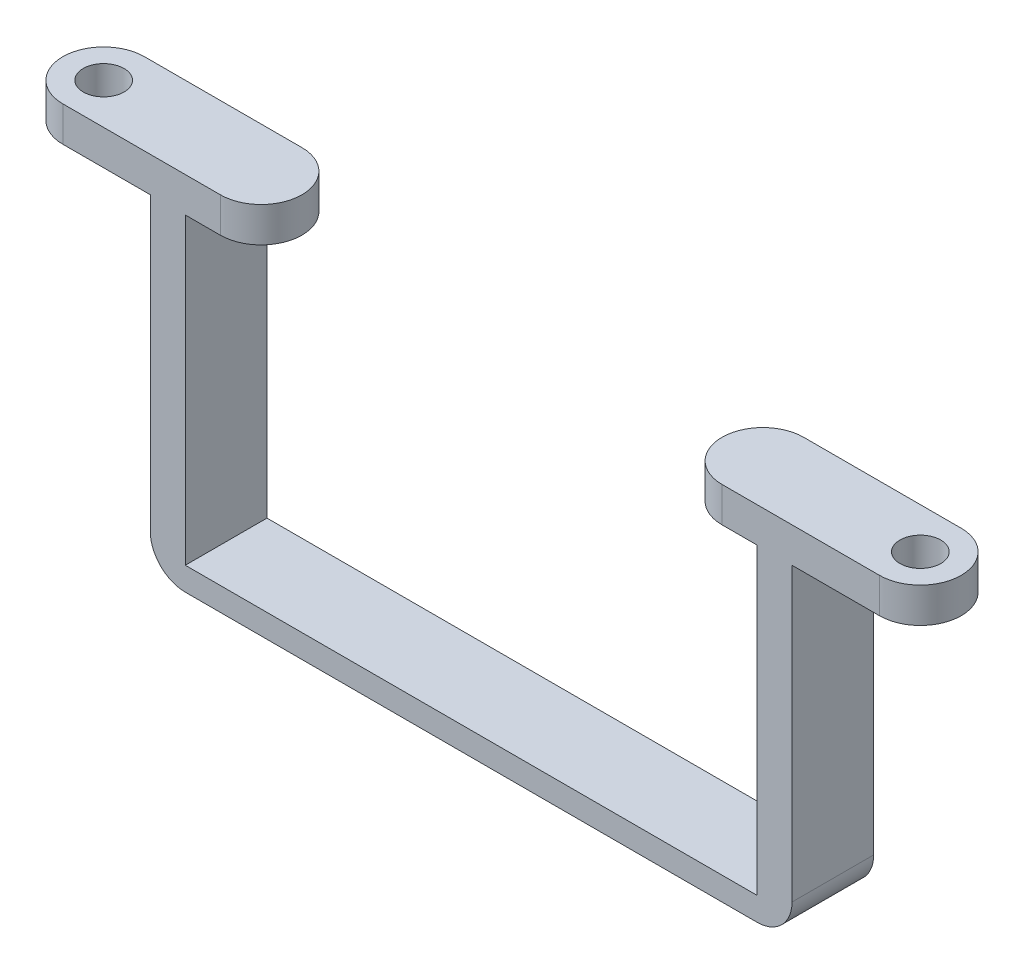
ISO-10303-21;
HEADER;
FILE_DESCRIPTION(('STEP AP214'),'2;1');
FILE_NAME('part.step','',(''),(''),'','','');
FILE_SCHEMA(('AUTOMOTIVE_DESIGN { 1 0 10303 214 1 1 1 1 }'));
ENDSEC;
DATA;
#1=APPLICATION_CONTEXT('core data for automotive mechanical design processes');
#2=APPLICATION_PROTOCOL_DEFINITION('international standard','automotive_design',2000,#1);
#3=PRODUCT_CONTEXT('',#1,'mechanical');
#4=PRODUCT('Part','Part','',(#3));
#5=PRODUCT_RELATED_PRODUCT_CATEGORY('part','',(#4));
#6=PRODUCT_DEFINITION_FORMATION('','',#4);
#7=PRODUCT_DEFINITION_CONTEXT('part definition',#1,'design');
#8=PRODUCT_DEFINITION('design','',#6,#7);
#9=PRODUCT_DEFINITION_SHAPE('','',#8);
#10=(LENGTH_UNIT() NAMED_UNIT(*) SI_UNIT(.MILLI.,.METRE.));
#11=(NAMED_UNIT(*) PLANE_ANGLE_UNIT() SI_UNIT($,.RADIAN.));
#12=(NAMED_UNIT(*) SI_UNIT($,.STERADIAN.) SOLID_ANGLE_UNIT());
#13=UNCERTAINTY_MEASURE_WITH_UNIT(LENGTH_MEASURE(1.E-05),#10,'distance_accuracy_value','');
#14=(GEOMETRIC_REPRESENTATION_CONTEXT(3) GLOBAL_UNCERTAINTY_ASSIGNED_CONTEXT((#13)) GLOBAL_UNIT_ASSIGNED_CONTEXT((#10,
#11,#12)) REPRESENTATION_CONTEXT('',''));
#15=CARTESIAN_POINT('',(0.,0.,0.));
#16=DIRECTION('',(0.,0.,1.));
#17=DIRECTION('',(1.,0.,0.));
#18=AXIS2_PLACEMENT_3D('',#15,#16,#17);
#19=CARTESIAN_POINT('',(0.,0.,0.));
#20=DIRECTION('',(0.,1.,0.));
#21=DIRECTION('',(0.,0.,1.));
#22=AXIS2_PLACEMENT_3D('',#19,#20,#21);
#23=PLANE('',#22);
#24=DIRECTION('',(1.,0.,0.));
#25=VECTOR('',#24,1.);
#26=CARTESIAN_POINT('',(10.5,0.,3.49999999999996));
#27=LINE('',#26,#25);
#28=CARTESIAN_POINT('',(10.5,0.,3.49999999999996));
#29=VERTEX_POINT('',#28);
#30=CARTESIAN_POINT('',(13.5,0.,3.49999999999996));
#31=VERTEX_POINT('',#30);
#32=EDGE_CURVE('E285',#29,#31,#27,.T.);
#33=ORIENTED_EDGE('',*,*,#32,.F.);
#34=DIRECTION('',(0.,0.,-1.));
#35=VECTOR('',#34,1.);
#36=CARTESIAN_POINT('',(10.5,0.,3.49999999999996));
#37=LINE('',#36,#35);
#38=CARTESIAN_POINT('',(10.5,0.,-3.49999999999996));
#39=VERTEX_POINT('',#38);
#40=EDGE_CURVE('E248',#29,#39,#37,.T.);
#41=ORIENTED_EDGE('',*,*,#40,.T.);
#42=DIRECTION('',(-1.,0.,0.));
#43=VECTOR('',#42,1.);
#44=CARTESIAN_POINT('',(0.,0.,-3.49999999999996));
#45=LINE('',#44,#43);
#46=CARTESIAN_POINT('',(13.5,0.,-3.49999999999996));
#47=VERTEX_POINT('',#46);
#48=EDGE_CURVE('E276',#47,#39,#45,.T.);
#49=ORIENTED_EDGE('',*,*,#48,.F.);
#50=CARTESIAN_POINT('',(13.5,0.,0.));
#51=DIRECTION('',(0.,1.,0.));
#52=DIRECTION('',(0.,0.,1.));
#53=AXIS2_PLACEMENT_3D('',#50,#51,#52);
#54=CIRCLE('',#53,3.49999999999996);
#55=EDGE_CURVE('E289',#31,#47,#54,.T.);
#56=ORIENTED_EDGE('',*,*,#55,.F.);
#57=EDGE_LOOP('',(#33,#41,#49,#56));
#58=FACE_BOUND('',#57,.T.);
#59=ADVANCED_FACE('F39',(#58),#23,.F.);
#60=CARTESIAN_POINT('',(0.,3.,0.));
#61=DIRECTION('',(0.,1.,0.));
#62=DIRECTION('',(0.,0.,1.));
#63=AXIS2_PLACEMENT_3D('',#60,#61,#62);
#64=PLANE('',#63);
#65=CARTESIAN_POINT('',(0.,3.,0.));
#66=DIRECTION('',(0.,1.,0.));
#67=DIRECTION('',(0.,0.,1.));
#68=AXIS2_PLACEMENT_3D('',#65,#66,#67);
#69=CIRCLE('',#68,3.49999999999996);
#70=CARTESIAN_POINT('',(0.,3.,-3.49999999999996));
#71=VERTEX_POINT('',#70);
#72=CARTESIAN_POINT('',(0.,3.,3.49999999999996));
#73=VERTEX_POINT('',#72);
#74=EDGE_CURVE('E272',#71,#73,#69,.T.);
#75=ORIENTED_EDGE('',*,*,#74,.T.);
#76=DIRECTION('',(1.,0.,0.));
#77=VECTOR('',#76,1.);
#78=CARTESIAN_POINT('',(10.5,3.,3.49999999999996));
#79=LINE('',#78,#77);
#80=CARTESIAN_POINT('',(13.5,3.,3.49999999999996));
#81=VERTEX_POINT('',#80);
#82=EDGE_CURVE('E275',#73,#81,#79,.T.);
#83=ORIENTED_EDGE('',*,*,#82,.T.);
#84=CARTESIAN_POINT('',(13.5,3.,0.));
#85=DIRECTION('',(0.,1.,0.));
#86=DIRECTION('',(0.,0.,1.));
#87=AXIS2_PLACEMENT_3D('',#84,#85,#86);
#88=CIRCLE('',#87,3.49999999999996);
#89=CARTESIAN_POINT('',(13.5,3.,-3.49999999999996));
#90=VERTEX_POINT('',#89);
#91=EDGE_CURVE('E278',#81,#90,#88,.T.);
#92=ORIENTED_EDGE('',*,*,#91,.T.);
#93=DIRECTION('',(-1.,0.,0.));
#94=VECTOR('',#93,1.);
#95=CARTESIAN_POINT('',(10.5,3.,-3.49999999999996));
#96=LINE('',#95,#94);
#97=EDGE_CURVE('E280',#90,#71,#96,.T.);
#98=ORIENTED_EDGE('',*,*,#97,.T.);
#99=EDGE_LOOP('',(#75,#83,#92,#98));
#100=FACE_BOUND('',#99,.T.);
#101=CARTESIAN_POINT('',(0.,3.,0.));
#102=DIRECTION('',(0.,1.,0.));
#103=DIRECTION('',(0.,0.,1.));
#104=AXIS2_PLACEMENT_3D('',#101,#102,#103);
#105=CIRCLE('',#104,1.75);
#106=CARTESIAN_POINT('',(0.,3.,1.75));
#107=VERTEX_POINT('',#106);
#108=EDGE_CURVE('E266',#107,#107,#105,.T.);
#109=ORIENTED_EDGE('',*,*,#108,.F.);
#110=EDGE_LOOP('',(#109));
#111=FACE_BOUND('',#110,.T.);
#112=ADVANCED_FACE('F361',(#100,#111),#64,.T.);
#113=CARTESIAN_POINT('',(7.5,0.,-3.49999999999996));
#114=VERTEX_POINT('',#113);
#115=CARTESIAN_POINT('',(0.,0.,-3.49999999999996));
#116=VERTEX_POINT('',#115);
#117=EDGE_CURVE('E292',#114,#116,#45,.T.);
#118=ORIENTED_EDGE('',*,*,#117,.F.);
#119=DIRECTION('',(0.,0.,1.));
#120=VECTOR('',#119,1.);
#121=CARTESIAN_POINT('',(7.5,0.,-3.49999999999996));
#122=LINE('',#121,#120);
#123=CARTESIAN_POINT('',(7.5,0.,3.49999999999996));
#124=VERTEX_POINT('',#123);
#125=EDGE_CURVE('E251',#114,#124,#122,.T.);
#126=ORIENTED_EDGE('',*,*,#125,.T.);
#127=CARTESIAN_POINT('',(0.,0.,3.49999999999996));
#128=VERTEX_POINT('',#127);
#129=EDGE_CURVE('E286',#128,#124,#27,.T.);
#130=ORIENTED_EDGE('',*,*,#129,.F.);
#131=CARTESIAN_POINT('',(0.,0.,0.));
#132=DIRECTION('',(0.,1.,0.));
#133=DIRECTION('',(0.,0.,1.));
#134=AXIS2_PLACEMENT_3D('',#131,#132,#133);
#135=CIRCLE('',#134,3.49999999999996);
#136=EDGE_CURVE('E269',#116,#128,#135,.T.);
#137=ORIENTED_EDGE('',*,*,#136,.F.);
#138=EDGE_LOOP('',(#118,#126,#130,#137));
#139=FACE_BOUND('',#138,.T.);
#140=CARTESIAN_POINT('',(0.,0.,0.));
#141=DIRECTION('',(0.,1.,0.));
#142=DIRECTION('',(0.,0.,1.));
#143=AXIS2_PLACEMENT_3D('',#140,#141,#142);
#144=CIRCLE('',#143,1.75);
#145=CARTESIAN_POINT('',(0.,0.,1.75));
#146=VERTEX_POINT('',#145);
#147=EDGE_CURVE('E265',#146,#146,#144,.T.);
#148=ORIENTED_EDGE('',*,*,#147,.T.);
#149=EDGE_LOOP('',(#148));
#150=FACE_BOUND('',#149,.T.);
#151=ADVANCED_FACE('F364',(#139,#150),#23,.F.);
#152=CARTESIAN_POINT('',(0.,3.,0.));
#153=DIRECTION('',(0.,-1.,0.));
#154=DIRECTION('',(0.,0.,-1.));
#155=AXIS2_PLACEMENT_3D('',#152,#153,#154);
#156=CYLINDRICAL_SURFACE('',#155,3.49999999999996);
#157=ORIENTED_EDGE('',*,*,#136,.T.);
#158=DIRECTION('',(0.,-1.,0.));
#159=VECTOR('',#158,1.);
#160=CARTESIAN_POINT('',(0.,3.,3.49999999999996));
#161=LINE('',#160,#159);
#162=EDGE_CURVE('E303',#73,#128,#161,.T.);
#163=ORIENTED_EDGE('',*,*,#162,.F.);
#164=ORIENTED_EDGE('',*,*,#74,.F.);
#165=DIRECTION('',(0.,-1.,0.));
#166=VECTOR('',#165,1.);
#167=CARTESIAN_POINT('',(0.,3.,-3.49999999999996));
#168=LINE('',#167,#166);
#169=EDGE_CURVE('E282',#71,#116,#168,.T.);
#170=ORIENTED_EDGE('',*,*,#169,.T.);
#171=EDGE_LOOP('',(#157,#163,#164,#170));
#172=FACE_BOUND('',#171,.T.);
#173=ADVANCED_FACE('F376',(#172),#156,.T.);
#174=CARTESIAN_POINT('',(10.5,3.,3.49999999999996));
#175=DIRECTION('',(0.,0.,-1.));
#176=DIRECTION('',(-1.,0.,0.));
#177=AXIS2_PLACEMENT_3D('',#174,#175,#176);
#178=PLANE('',#177);
#179=DIRECTION('',(0.,1.,0.));
#180=VECTOR('',#179,1.);
#181=CARTESIAN_POINT('',(7.5,-34.6157731058638,3.49999999999996));
#182=LINE('',#181,#180);
#183=CARTESIAN_POINT('',(7.5,-25.,3.49999999999996));
#184=VERTEX_POINT('',#183);
#185=EDGE_CURVE('E261',#184,#124,#182,.T.);
#186=ORIENTED_EDGE('',*,*,#185,.F.);
#187=CARTESIAN_POINT('',(10.5,-25.,3.49999999999996));
#188=DIRECTION('',(0.,0.,-1.));
#189=DIRECTION('',(-1.,0.,0.));
#190=AXIS2_PLACEMENT_3D('',#187,#188,#189);
#191=CIRCLE('',#190,3.);
#192=CARTESIAN_POINT('',(10.5,-28.,3.49999999999996));
#193=VERTEX_POINT('',#192);
#194=EDGE_CURVE('E11',#184,#193,#191,.F.);
#195=ORIENTED_EDGE('',*,*,#194,.T.);
#196=DIRECTION('',(-1.,0.,0.));
#197=VECTOR('',#196,1.);
#198=CARTESIAN_POINT('',(34.9999996403708,-28.,3.49999999999997));
#199=LINE('',#198,#197);
#200=CARTESIAN_POINT('',(59.4999992807416,-28.,3.49999999999996));
#201=VERTEX_POINT('',#200);
#202=EDGE_CURVE('E244',#201,#193,#199,.T.);
#203=ORIENTED_EDGE('',*,*,#202,.F.);
#204=CARTESIAN_POINT('',(59.4999992807416,-25.,3.49999999999996));
#205=DIRECTION('',(0.,0.,1.));
#206=DIRECTION('',(1.,0.,0.));
#207=AXIS2_PLACEMENT_3D('',#204,#205,#206);
#208=CIRCLE('',#207,3.);
#209=CARTESIAN_POINT('',(62.4999992807416,-25.,3.49999999999996));
#210=VERTEX_POINT('',#209);
#211=EDGE_CURVE('E173',#210,#201,#208,.F.);
#212=ORIENTED_EDGE('',*,*,#211,.F.);
#213=DIRECTION('',(0.,1.,0.));
#214=VECTOR('',#213,1.);
#215=CARTESIAN_POINT('',(62.4999992807416,-34.6157731058638,3.49999999999996));
#216=LINE('',#215,#214);
#217=CARTESIAN_POINT('',(62.4999992807416,0.,3.49999999999996));
#218=VERTEX_POINT('',#217);
#219=EDGE_CURVE('E186',#210,#218,#216,.T.);
#220=ORIENTED_EDGE('',*,*,#219,.T.);
#221=DIRECTION('',(-1.,0.,0.));
#222=VECTOR('',#221,1.);
#223=CARTESIAN_POINT('',(59.4999992807416,0.,3.49999999999996));
#224=LINE('',#223,#222);
#225=CARTESIAN_POINT('',(69.9999992807416,0.,3.49999999999996));
#226=VERTEX_POINT('',#225);
#227=EDGE_CURVE('E218',#226,#218,#224,.T.);
#228=ORIENTED_EDGE('',*,*,#227,.F.);
#229=DIRECTION('',(0.,-1.,0.));
#230=VECTOR('',#229,1.);
#231=CARTESIAN_POINT('',(69.9999992807416,3.,3.49999999999996));
#232=LINE('',#231,#230);
#233=CARTESIAN_POINT('',(69.9999992807416,3.,3.49999999999996));
#234=VERTEX_POINT('',#233);
#235=EDGE_CURVE('E232',#234,#226,#232,.T.);
#236=ORIENTED_EDGE('',*,*,#235,.F.);
#237=DIRECTION('',(-1.,0.,0.));
#238=VECTOR('',#237,1.);
#239=CARTESIAN_POINT('',(59.4999992807416,3.,3.49999999999996));
#240=LINE('',#239,#238);
#241=CARTESIAN_POINT('',(56.4999992807416,3.,3.49999999999996));
#242=VERTEX_POINT('',#241);
#243=EDGE_CURVE('E205',#234,#242,#240,.T.);
#244=ORIENTED_EDGE('',*,*,#243,.T.);
#245=DIRECTION('',(0.,-1.,0.));
#246=VECTOR('',#245,1.);
#247=CARTESIAN_POINT('',(56.4999992807416,3.,3.49999999999996));
#248=LINE('',#247,#246);
#249=CARTESIAN_POINT('',(56.4999992807416,0.,3.49999999999996));
#250=VERTEX_POINT('',#249);
#251=EDGE_CURVE('E230',#242,#250,#248,.T.);
#252=ORIENTED_EDGE('',*,*,#251,.T.);
#253=CARTESIAN_POINT('',(59.4999992807416,0.,3.49999999999996));
#254=VERTEX_POINT('',#253);
#255=EDGE_CURVE('E185',#254,#250,#224,.T.);
#256=ORIENTED_EDGE('',*,*,#255,.F.);
#257=DIRECTION('',(0.,1.,0.));
#258=VECTOR('',#257,1.);
#259=CARTESIAN_POINT('',(59.4999992807416,-34.6157731058638,3.49999999999996));
#260=LINE('',#259,#258);
#261=CARTESIAN_POINT('',(59.4999992807416,-26.,3.49999999999996));
#262=VERTEX_POINT('',#261);
#263=EDGE_CURVE('E178',#262,#254,#260,.T.);
#264=ORIENTED_EDGE('',*,*,#263,.F.);
#265=DIRECTION('',(-1.,0.,0.));
#266=VECTOR('',#265,1.);
#267=CARTESIAN_POINT('',(34.9999996403708,-26.,3.49999999999997));
#268=LINE('',#267,#266);
#269=CARTESIAN_POINT('',(10.5,-26.,3.49999999999996));
#270=VERTEX_POINT('',#269);
#271=EDGE_CURVE('E162',#262,#270,#268,.T.);
#272=ORIENTED_EDGE('',*,*,#271,.T.);
#273=DIRECTION('',(0.,1.,0.));
#274=VECTOR('',#273,1.);
#275=CARTESIAN_POINT('',(10.5,-34.6157731058638,3.49999999999996));
#276=LINE('',#275,#274);
#277=EDGE_CURVE('E259',#270,#29,#276,.T.);
#278=ORIENTED_EDGE('',*,*,#277,.T.);
#279=ORIENTED_EDGE('',*,*,#32,.T.);
#280=DIRECTION('',(0.,-1.,0.));
#281=VECTOR('',#280,1.);
#282=CARTESIAN_POINT('',(13.5,3.,3.49999999999996));
#283=LINE('',#282,#281);
#284=EDGE_CURVE('E300',#81,#31,#283,.T.);
#285=ORIENTED_EDGE('',*,*,#284,.F.);
#286=ORIENTED_EDGE('',*,*,#82,.F.);
#287=ORIENTED_EDGE('',*,*,#162,.T.);
#288=ORIENTED_EDGE('',*,*,#129,.T.);
#289=EDGE_LOOP('',(#186,#195,#203,#212,#220,#228,#236,#244,#252,#256,#264,#272,#278,#279,#285,
#286,#287,#288));
#290=FACE_BOUND('',#289,.T.);
#291=ADVANCED_FACE('F183',(#290),#178,.F.);
#292=CARTESIAN_POINT('',(13.5,3.,0.));
#293=DIRECTION('',(0.,-1.,0.));
#294=DIRECTION('',(0.,0.,-1.));
#295=AXIS2_PLACEMENT_3D('',#292,#293,#294);
#296=CYLINDRICAL_SURFACE('',#295,3.49999999999996);
#297=ORIENTED_EDGE('',*,*,#55,.T.);
#298=DIRECTION('',(0.,-1.,0.));
#299=VECTOR('',#298,1.);
#300=CARTESIAN_POINT('',(13.5,3.,-3.49999999999996));
#301=LINE('',#300,#299);
#302=EDGE_CURVE('E297',#90,#47,#301,.T.);
#303=ORIENTED_EDGE('',*,*,#302,.F.);
#304=ORIENTED_EDGE('',*,*,#91,.F.);
#305=ORIENTED_EDGE('',*,*,#284,.T.);
#306=EDGE_LOOP('',(#297,#303,#304,#305));
#307=FACE_BOUND('',#306,.T.);
#308=ADVANCED_FACE('F399',(#307),#296,.T.);
#309=CARTESIAN_POINT('',(0.,3.,-3.49999999999996));
#310=DIRECTION('',(0.,0.,1.));
#311=DIRECTION('',(1.,0.,0.));
#312=AXIS2_PLACEMENT_3D('',#309,#310,#311);
#313=PLANE('',#312);
#314=DIRECTION('',(1.,0.,0.));
#315=VECTOR('',#314,1.);
#316=CARTESIAN_POINT('',(7.5,-28.,-3.49999999999996));
#317=LINE('',#316,#315);
#318=CARTESIAN_POINT('',(10.5,-28.,-3.49999999999996));
#319=VERTEX_POINT('',#318);
#320=CARTESIAN_POINT('',(59.4999992807416,-28.,-3.49999999999996));
#321=VERTEX_POINT('',#320);
#322=EDGE_CURVE('E247',#319,#321,#317,.T.);
#323=ORIENTED_EDGE('',*,*,#322,.F.);
#324=CARTESIAN_POINT('',(10.5,-25.,-3.49999999999996));
#325=DIRECTION('',(0.,0.,1.));
#326=DIRECTION('',(1.,0.,0.));
#327=AXIS2_PLACEMENT_3D('',#324,#325,#326);
#328=CIRCLE('',#327,3.);
#329=CARTESIAN_POINT('',(7.5,-25.,-3.49999999999996));
#330=VERTEX_POINT('',#329);
#331=EDGE_CURVE('E61',#319,#330,#328,.F.);
#332=ORIENTED_EDGE('',*,*,#331,.T.);
#333=DIRECTION('',(0.,1.,0.));
#334=VECTOR('',#333,1.);
#335=CARTESIAN_POINT('',(7.5,-34.6157731058638,-3.49999999999996));
#336=LINE('',#335,#334);
#337=EDGE_CURVE('E254',#330,#114,#336,.T.);
#338=ORIENTED_EDGE('',*,*,#337,.T.);
#339=ORIENTED_EDGE('',*,*,#117,.T.);
#340=ORIENTED_EDGE('',*,*,#169,.F.);
#341=ORIENTED_EDGE('',*,*,#97,.F.);
#342=ORIENTED_EDGE('',*,*,#302,.T.);
#343=ORIENTED_EDGE('',*,*,#48,.T.);
#344=DIRECTION('',(0.,1.,0.));
#345=VECTOR('',#344,1.);
#346=CARTESIAN_POINT('',(10.5,-34.6157731058638,-3.49999999999996));
#347=LINE('',#346,#345);
#348=CARTESIAN_POINT('',(10.5,-26.,-3.49999999999996));
#349=VERTEX_POINT('',#348);
#350=EDGE_CURVE('E258',#349,#39,#347,.T.);
#351=ORIENTED_EDGE('',*,*,#350,.F.);
#352=DIRECTION('',(1.,0.,0.));
#353=VECTOR('',#352,1.);
#354=CARTESIAN_POINT('',(7.5,-26.,-3.49999999999996));
#355=LINE('',#354,#353);
#356=CARTESIAN_POINT('',(59.4999992807416,-26.,-3.49999999999996));
#357=VERTEX_POINT('',#356);
#358=EDGE_CURVE('E172',#349,#357,#355,.T.);
#359=ORIENTED_EDGE('',*,*,#358,.T.);
#360=DIRECTION('',(0.,1.,0.));
#361=VECTOR('',#360,1.);
#362=CARTESIAN_POINT('',(59.4999992807416,-34.6157731058638,-3.49999999999996));
#363=LINE('',#362,#361);
#364=CARTESIAN_POINT('',(59.4999992807416,0.,-3.49999999999996));
#365=VERTEX_POINT('',#364);
#366=EDGE_CURVE('E180',#357,#365,#363,.T.);
#367=ORIENTED_EDGE('',*,*,#366,.T.);
#368=DIRECTION('',(1.,0.,0.));
#369=VECTOR('',#368,1.);
#370=CARTESIAN_POINT('',(69.9999992807416,0.,-3.49999999999996));
#371=LINE('',#370,#369);
#372=CARTESIAN_POINT('',(56.4999992807416,0.,-3.49999999999996));
#373=VERTEX_POINT('',#372);
#374=EDGE_CURVE('E206',#373,#365,#371,.T.);
#375=ORIENTED_EDGE('',*,*,#374,.F.);
#376=DIRECTION('',(0.,-1.,0.));
#377=VECTOR('',#376,1.);
#378=CARTESIAN_POINT('',(56.4999992807416,3.,-3.49999999999996));
#379=LINE('',#378,#377);
#380=CARTESIAN_POINT('',(56.4999992807416,3.,-3.49999999999996));
#381=VERTEX_POINT('',#380);
#382=EDGE_CURVE('E228',#381,#373,#379,.T.);
#383=ORIENTED_EDGE('',*,*,#382,.F.);
#384=DIRECTION('',(1.,0.,0.));
#385=VECTOR('',#384,1.);
#386=CARTESIAN_POINT('',(59.4999992807416,3.,-3.49999999999996));
#387=LINE('',#386,#385);
#388=CARTESIAN_POINT('',(69.9999992807416,3.,-3.49999999999996));
#389=VERTEX_POINT('',#388);
#390=EDGE_CURVE('E212',#381,#389,#387,.T.);
#391=ORIENTED_EDGE('',*,*,#390,.T.);
#392=DIRECTION('',(0.,-1.,0.));
#393=VECTOR('',#392,1.);
#394=CARTESIAN_POINT('',(69.9999992807416,3.,-3.49999999999996));
#395=LINE('',#394,#393);
#396=CARTESIAN_POINT('',(69.9999992807416,0.,-3.49999999999996));
#397=VERTEX_POINT('',#396);
#398=EDGE_CURVE('E215',#389,#397,#395,.T.);
#399=ORIENTED_EDGE('',*,*,#398,.T.);
#400=CARTESIAN_POINT('',(62.4999992807416,0.,-3.49999999999996));
#401=VERTEX_POINT('',#400);
#402=EDGE_CURVE('E224',#401,#397,#371,.T.);
#403=ORIENTED_EDGE('',*,*,#402,.F.);
#404=DIRECTION('',(0.,1.,0.));
#405=VECTOR('',#404,1.);
#406=CARTESIAN_POINT('',(62.4999992807416,-34.6157731058638,-3.49999999999996));
#407=LINE('',#406,#405);
#408=CARTESIAN_POINT('',(62.4999992807416,-25.,-3.49999999999996));
#409=VERTEX_POINT('',#408);
#410=EDGE_CURVE('E188',#409,#401,#407,.T.);
#411=ORIENTED_EDGE('',*,*,#410,.F.);
#412=CARTESIAN_POINT('',(59.4999992807416,-25.,-3.49999999999996));
#413=DIRECTION('',(0.,0.,-1.));
#414=DIRECTION('',(-1.,0.,0.));
#415=AXIS2_PLACEMENT_3D('',#412,#413,#414);
#416=CIRCLE('',#415,3.);
#417=EDGE_CURVE('E237',#321,#409,#416,.F.);
#418=ORIENTED_EDGE('',*,*,#417,.F.);
#419=EDGE_LOOP('',(#323,#332,#338,#339,#340,#341,#342,#343,#351,#359,#367,#375,#383,#391,#399,
#403,#411,#418));
#420=FACE_BOUND('',#419,.T.);
#421=ADVANCED_FACE('F316',(#420),#313,.F.);
#422=CARTESIAN_POINT('',(0.,3.,0.));
#423=DIRECTION('',(0.,-1.,0.));
#424=DIRECTION('',(0.,0.,-1.));
#425=AXIS2_PLACEMENT_3D('',#422,#423,#424);
#426=CYLINDRICAL_SURFACE('',#425,1.75);
#427=ORIENTED_EDGE('',*,*,#108,.T.);
#428=EDGE_LOOP('',(#427));
#429=FACE_BOUND('',#428,.T.);
#430=ORIENTED_EDGE('',*,*,#147,.F.);
#431=EDGE_LOOP('',(#430));
#432=FACE_BOUND('',#431,.T.);
#433=ADVANCED_FACE('F387',(#429,#432),#426,.F.);
#434=CARTESIAN_POINT('',(7.5,-34.6157731058638,-3.49999999999996));
#435=DIRECTION('',(-1.,0.,0.));
#436=DIRECTION('',(0.,0.,1.));
#437=AXIS2_PLACEMENT_3D('',#434,#435,#436);
#438=PLANE('',#437);
#439=ORIENTED_EDGE('',*,*,#337,.F.);
#440=DIRECTION('',(0.,0.,-1.));
#441=VECTOR('',#440,1.);
#442=CARTESIAN_POINT('',(7.5,-25.,-3.49999999999996));
#443=LINE('',#442,#441);
#444=EDGE_CURVE('E47',#330,#184,#443,.F.);
#445=ORIENTED_EDGE('',*,*,#444,.T.);
#446=ORIENTED_EDGE('',*,*,#185,.T.);
#447=ORIENTED_EDGE('',*,*,#125,.F.);
#448=EDGE_LOOP('',(#439,#445,#446,#447));
#449=FACE_BOUND('',#448,.T.);
#450=ADVANCED_FACE('F389',(#449),#438,.T.);
#451=CARTESIAN_POINT('',(10.5,-34.6157731058638,3.49999999999996));
#452=DIRECTION('',(1.,0.,0.));
#453=DIRECTION('',(0.,0.,-1.));
#454=AXIS2_PLACEMENT_3D('',#451,#452,#453);
#455=PLANE('',#454);
#456=ORIENTED_EDGE('',*,*,#277,.F.);
#457=DIRECTION('',(0.,0.,-1.));
#458=VECTOR('',#457,1.);
#459=CARTESIAN_POINT('',(10.5,-26.,3.49999999999996));
#460=LINE('',#459,#458);
#461=EDGE_CURVE('E168',#270,#349,#460,.T.);
#462=ORIENTED_EDGE('',*,*,#461,.T.);
#463=ORIENTED_EDGE('',*,*,#350,.T.);
#464=ORIENTED_EDGE('',*,*,#40,.F.);
#465=EDGE_LOOP('',(#456,#462,#463,#464));
#466=FACE_BOUND('',#465,.T.);
#467=ADVANCED_FACE('F396',(#466),#455,.T.);
#468=CARTESIAN_POINT('',(0.,-28.,0.));
#469=DIRECTION('',(0.,-1.,0.));
#470=DIRECTION('',(0.,0.,-1.));
#471=AXIS2_PLACEMENT_3D('',#468,#469,#470);
#472=PLANE('',#471);
#473=ORIENTED_EDGE('',*,*,#202,.T.);
#474=DIRECTION('',(0.,0.,-1.));
#475=VECTOR('',#474,1.);
#476=CARTESIAN_POINT('',(10.5,-28.,0.));
#477=LINE('',#476,#475);
#478=EDGE_CURVE('E306',#193,#319,#477,.T.);
#479=ORIENTED_EDGE('',*,*,#478,.T.);
#480=ORIENTED_EDGE('',*,*,#322,.T.);
#481=DIRECTION('',(0.,0.,-1.));
#482=VECTOR('',#481,1.);
#483=CARTESIAN_POINT('',(59.4999992807416,-28.,0.));
#484=LINE('',#483,#482);
#485=EDGE_CURVE('E234',#201,#321,#484,.T.);
#486=ORIENTED_EDGE('',*,*,#485,.F.);
#487=EDGE_LOOP('',(#473,#479,#480,#486));
#488=FACE_BOUND('',#487,.T.);
#489=ADVANCED_FACE('F311',(#488),#472,.T.);
#490=CARTESIAN_POINT('',(0.,-26.,0.));
#491=DIRECTION('',(0.,-1.,0.));
#492=DIRECTION('',(0.,0.,-1.));
#493=AXIS2_PLACEMENT_3D('',#490,#491,#492);
#494=PLANE('',#493);
#495=ORIENTED_EDGE('',*,*,#461,.F.);
#496=ORIENTED_EDGE('',*,*,#271,.F.);
#497=DIRECTION('',(0.,0.,-1.));
#498=VECTOR('',#497,1.);
#499=CARTESIAN_POINT('',(59.4999992807416,-26.,3.49999999999996));
#500=LINE('',#499,#498);
#501=EDGE_CURVE('E165',#262,#357,#500,.T.);
#502=ORIENTED_EDGE('',*,*,#501,.T.);
#503=ORIENTED_EDGE('',*,*,#358,.F.);
#504=EDGE_LOOP('',(#495,#496,#502,#503));
#505=FACE_BOUND('',#504,.T.);
#506=ADVANCED_FACE('F164',(#505),#494,.F.);
#507=CARTESIAN_POINT('',(10.5,-25.,0.));
#508=DIRECTION('',(0.,0.,-1.));
#509=DIRECTION('',(-1.,0.,0.));
#510=AXIS2_PLACEMENT_3D('',#507,#508,#509);
#511=CYLINDRICAL_SURFACE('',#510,3.);
#512=ORIENTED_EDGE('',*,*,#194,.F.);
#513=ORIENTED_EDGE('',*,*,#444,.F.);
#514=ORIENTED_EDGE('',*,*,#331,.F.);
#515=ORIENTED_EDGE('',*,*,#478,.F.);
#516=EDGE_LOOP('',(#512,#513,#514,#515));
#517=FACE_BOUND('',#516,.T.);
#518=ADVANCED_FACE('F41',(#517),#511,.T.);
#519=CARTESIAN_POINT('',(69.9999992807416,0.,0.));
#520=DIRECTION('',(0.,1.,0.));
#521=DIRECTION('',(0.,0.,1.));
#522=AXIS2_PLACEMENT_3D('',#519,#520,#521);
#523=PLANE('',#522);
#524=ORIENTED_EDGE('',*,*,#255,.T.);
#525=CARTESIAN_POINT('',(56.4999992807416,0.,0.));
#526=DIRECTION('',(0.,-1.,0.));
#527=DIRECTION('',(0.,0.,1.));
#528=AXIS2_PLACEMENT_3D('',#525,#526,#527);
#529=CIRCLE('',#528,3.49999999999996);
#530=EDGE_CURVE('E221',#250,#373,#529,.T.);
#531=ORIENTED_EDGE('',*,*,#530,.T.);
#532=ORIENTED_EDGE('',*,*,#374,.T.);
#533=DIRECTION('',(0.,0.,-1.));
#534=VECTOR('',#533,1.);
#535=CARTESIAN_POINT('',(59.4999992807416,0.,3.49999999999996));
#536=LINE('',#535,#534);
#537=EDGE_CURVE('E330',#254,#365,#536,.T.);
#538=ORIENTED_EDGE('',*,*,#537,.F.);
#539=EDGE_LOOP('',(#524,#531,#532,#538));
#540=FACE_BOUND('',#539,.T.);
#541=ADVANCED_FACE('F349',(#540),#523,.F.);
#542=CARTESIAN_POINT('',(69.9999992807416,3.,0.));
#543=DIRECTION('',(0.,1.,0.));
#544=DIRECTION('',(0.,0.,1.));
#545=AXIS2_PLACEMENT_3D('',#542,#543,#544);
#546=PLANE('',#545);
#547=CARTESIAN_POINT('',(69.9999992807416,3.,0.));
#548=DIRECTION('',(0.,-1.,0.));
#549=DIRECTION('',(0.,0.,1.));
#550=AXIS2_PLACEMENT_3D('',#547,#548,#549);
#551=CIRCLE('',#550,3.49999999999996);
#552=EDGE_CURVE('E202',#389,#234,#551,.T.);
#553=ORIENTED_EDGE('',*,*,#552,.F.);
#554=ORIENTED_EDGE('',*,*,#390,.F.);
#555=CARTESIAN_POINT('',(56.4999992807416,3.,0.));
#556=DIRECTION('',(0.,-1.,0.));
#557=DIRECTION('',(0.,0.,1.));
#558=AXIS2_PLACEMENT_3D('',#555,#556,#557);
#559=CIRCLE('',#558,3.49999999999996);
#560=EDGE_CURVE('E209',#242,#381,#559,.T.);
#561=ORIENTED_EDGE('',*,*,#560,.F.);
#562=ORIENTED_EDGE('',*,*,#243,.F.);
#563=EDGE_LOOP('',(#553,#554,#561,#562));
#564=FACE_BOUND('',#563,.T.);
#565=CARTESIAN_POINT('',(69.9999992807416,3.,0.));
#566=DIRECTION('',(0.,-1.,0.));
#567=DIRECTION('',(0.,0.,1.));
#568=AXIS2_PLACEMENT_3D('',#565,#566,#567);
#569=CIRCLE('',#568,1.75);
#570=CARTESIAN_POINT('',(69.9999992807416,3.,1.75));
#571=VERTEX_POINT('',#570);
#572=EDGE_CURVE('E196',#571,#571,#569,.T.);
#573=ORIENTED_EDGE('',*,*,#572,.T.);
#574=EDGE_LOOP('',(#573));
#575=FACE_BOUND('',#574,.T.);
#576=ADVANCED_FACE('F340',(#564,#575),#546,.T.);
#577=ORIENTED_EDGE('',*,*,#402,.T.);
#578=CARTESIAN_POINT('',(69.9999992807416,0.,0.));
#579=DIRECTION('',(0.,-1.,0.));
#580=DIRECTION('',(0.,0.,1.));
#581=AXIS2_PLACEMENT_3D('',#578,#579,#580);
#582=CIRCLE('',#581,3.49999999999996);
#583=EDGE_CURVE('E199',#397,#226,#582,.T.);
#584=ORIENTED_EDGE('',*,*,#583,.T.);
#585=ORIENTED_EDGE('',*,*,#227,.T.);
#586=DIRECTION('',(0.,0.,1.));
#587=VECTOR('',#586,1.);
#588=CARTESIAN_POINT('',(62.4999992807416,0.,-3.49999999999996));
#589=LINE('',#588,#587);
#590=EDGE_CURVE('E193',#401,#218,#589,.T.);
#591=ORIENTED_EDGE('',*,*,#590,.F.);
#592=EDGE_LOOP('',(#577,#584,#585,#591));
#593=FACE_BOUND('',#592,.T.);
#594=CARTESIAN_POINT('',(69.9999992807416,0.,0.));
#595=DIRECTION('',(0.,-1.,0.));
#596=DIRECTION('',(0.,0.,1.));
#597=AXIS2_PLACEMENT_3D('',#594,#595,#596);
#598=CIRCLE('',#597,1.75);
#599=CARTESIAN_POINT('',(69.9999992807416,0.,1.75));
#600=VERTEX_POINT('',#599);
#601=EDGE_CURVE('E195',#600,#600,#598,.T.);
#602=ORIENTED_EDGE('',*,*,#601,.F.);
#603=EDGE_LOOP('',(#602));
#604=FACE_BOUND('',#603,.T.);
#605=ADVANCED_FACE('F332',(#593,#604),#523,.F.);
#606=CARTESIAN_POINT('',(69.9999992807416,3.,0.));
#607=DIRECTION('',(0.,-1.,0.));
#608=DIRECTION('',(0.,0.,-1.));
#609=AXIS2_PLACEMENT_3D('',#606,#607,#608);
#610=CYLINDRICAL_SURFACE('',#609,3.49999999999996);
#611=ORIENTED_EDGE('',*,*,#583,.F.);
#612=ORIENTED_EDGE('',*,*,#398,.F.);
#613=ORIENTED_EDGE('',*,*,#552,.T.);
#614=ORIENTED_EDGE('',*,*,#235,.T.);
#615=EDGE_LOOP('',(#611,#612,#613,#614));
#616=FACE_BOUND('',#615,.T.);
#617=ADVANCED_FACE('F343',(#616),#610,.T.);
#618=CARTESIAN_POINT('',(56.4999992807416,3.,0.));
#619=DIRECTION('',(0.,-1.,0.));
#620=DIRECTION('',(0.,0.,-1.));
#621=AXIS2_PLACEMENT_3D('',#618,#619,#620);
#622=CYLINDRICAL_SURFACE('',#621,3.49999999999996);
#623=ORIENTED_EDGE('',*,*,#530,.F.);
#624=ORIENTED_EDGE('',*,*,#251,.F.);
#625=ORIENTED_EDGE('',*,*,#560,.T.);
#626=ORIENTED_EDGE('',*,*,#382,.T.);
#627=EDGE_LOOP('',(#623,#624,#625,#626));
#628=FACE_BOUND('',#627,.T.);
#629=ADVANCED_FACE('F347',(#628),#622,.T.);
#630=CARTESIAN_POINT('',(69.9999992807416,3.,0.));
#631=DIRECTION('',(0.,-1.,0.));
#632=DIRECTION('',(0.,0.,-1.));
#633=AXIS2_PLACEMENT_3D('',#630,#631,#632);
#634=CYLINDRICAL_SURFACE('',#633,1.75);
#635=ORIENTED_EDGE('',*,*,#572,.F.);
#636=EDGE_LOOP('',(#635));
#637=FACE_BOUND('',#636,.T.);
#638=ORIENTED_EDGE('',*,*,#601,.T.);
#639=EDGE_LOOP('',(#638));
#640=FACE_BOUND('',#639,.T.);
#641=ADVANCED_FACE('F411',(#637,#640),#634,.F.);
#642=CARTESIAN_POINT('',(62.4999992807416,-34.6157731058638,-3.49999999999996));
#643=DIRECTION('',(1.,0.,0.));
#644=DIRECTION('',(0.,0.,1.));
#645=AXIS2_PLACEMENT_3D('',#642,#643,#644);
#646=PLANE('',#645);
#647=ORIENTED_EDGE('',*,*,#410,.T.);
#648=ORIENTED_EDGE('',*,*,#590,.T.);
#649=ORIENTED_EDGE('',*,*,#219,.F.);
#650=DIRECTION('',(0.,0.,-1.));
#651=VECTOR('',#650,1.);
#652=CARTESIAN_POINT('',(62.4999992807416,-25.,-3.49999999999996));
#653=LINE('',#652,#651);
#654=EDGE_CURVE('E240',#409,#210,#653,.F.);
#655=ORIENTED_EDGE('',*,*,#654,.F.);
#656=EDGE_LOOP('',(#647,#648,#649,#655));
#657=FACE_BOUND('',#656,.T.);
#658=ADVANCED_FACE('F326',(#657),#646,.T.);
#659=CARTESIAN_POINT('',(59.4999992807416,-34.6157731058638,3.49999999999996));
#660=DIRECTION('',(-1.,0.,0.));
#661=DIRECTION('',(0.,0.,-1.));
#662=AXIS2_PLACEMENT_3D('',#659,#660,#661);
#663=PLANE('',#662);
#664=ORIENTED_EDGE('',*,*,#263,.T.);
#665=ORIENTED_EDGE('',*,*,#537,.T.);
#666=ORIENTED_EDGE('',*,*,#366,.F.);
#667=ORIENTED_EDGE('',*,*,#501,.F.);
#668=EDGE_LOOP('',(#664,#665,#666,#667));
#669=FACE_BOUND('',#668,.T.);
#670=ADVANCED_FACE('F176',(#669),#663,.T.);
#671=CARTESIAN_POINT('',(59.4999992807416,-25.,0.));
#672=DIRECTION('',(0.,0.,-1.));
#673=DIRECTION('',(1.,0.,0.));
#674=AXIS2_PLACEMENT_3D('',#671,#672,#673);
#675=CYLINDRICAL_SURFACE('',#674,3.);
#676=ORIENTED_EDGE('',*,*,#211,.T.);
#677=ORIENTED_EDGE('',*,*,#485,.T.);
#678=ORIENTED_EDGE('',*,*,#417,.T.);
#679=ORIENTED_EDGE('',*,*,#654,.T.);
#680=EDGE_LOOP('',(#676,#677,#678,#679));
#681=FACE_BOUND('',#680,.T.);
#682=ADVANCED_FACE('F320',(#681),#675,.T.);
#683=CLOSED_SHELL('',(#59,#112,#151,#173,#291,#308,#421,#433,#450,#467,#489,#506,#518,#541,#576,
#605,#617,#629,#641,#658,#670,#682));
#684=MANIFOLD_SOLID_BREP('B2',#683);
#685=ADVANCED_BREP_SHAPE_REPRESENTATION('',(#18,#684),#14);
#686=SHAPE_DEFINITION_REPRESENTATION(#9,#685);
ENDSEC;
END-ISO-10303-21;
